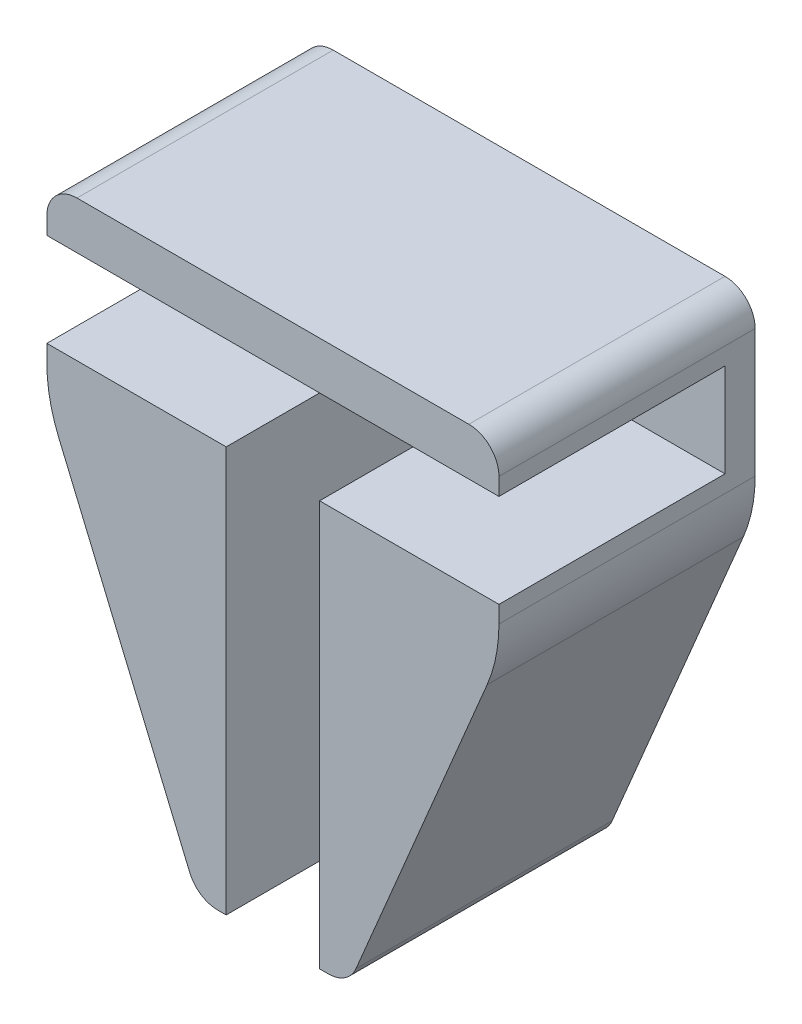
ISO-10303-21;
HEADER;
FILE_DESCRIPTION(('STEP AP214'),'2;1');
FILE_NAME('part.step','',(''),(''),'','','');
FILE_SCHEMA(('AUTOMOTIVE_DESIGN { 1 0 10303 214 1 1 1 1 }'));
ENDSEC;
DATA;
#1=APPLICATION_CONTEXT('core data for automotive mechanical design processes');
#2=APPLICATION_PROTOCOL_DEFINITION('international standard','automotive_design',2000,#1);
#3=PRODUCT_CONTEXT('',#1,'mechanical');
#4=PRODUCT('Part','Part','',(#3));
#5=PRODUCT_RELATED_PRODUCT_CATEGORY('part','',(#4));
#6=PRODUCT_DEFINITION_FORMATION('','',#4);
#7=PRODUCT_DEFINITION_CONTEXT('part definition',#1,'design');
#8=PRODUCT_DEFINITION('design','',#6,#7);
#9=PRODUCT_DEFINITION_SHAPE('','',#8);
#10=(LENGTH_UNIT() NAMED_UNIT(*) SI_UNIT(.MILLI.,.METRE.));
#11=(NAMED_UNIT(*) PLANE_ANGLE_UNIT() SI_UNIT($,.RADIAN.));
#12=(NAMED_UNIT(*) SI_UNIT($,.STERADIAN.) SOLID_ANGLE_UNIT());
#13=UNCERTAINTY_MEASURE_WITH_UNIT(LENGTH_MEASURE(1.E-05),#10,'distance_accuracy_value','');
#14=(GEOMETRIC_REPRESENTATION_CONTEXT(3) GLOBAL_UNCERTAINTY_ASSIGNED_CONTEXT((#13)) GLOBAL_UNIT_ASSIGNED_CONTEXT((#10,
#11,#12)) REPRESENTATION_CONTEXT('',''));
#15=CARTESIAN_POINT('',(0.,0.,0.));
#16=DIRECTION('',(0.,0.,1.));
#17=DIRECTION('',(1.,0.,0.));
#18=AXIS2_PLACEMENT_3D('',#15,#16,#17);
#19=CARTESIAN_POINT('',(-15.,0.,15.));
#20=DIRECTION('',(1.,0.,0.));
#21=DIRECTION('',(0.,0.,-1.));
#22=AXIS2_PLACEMENT_3D('',#19,#20,#21);
#23=PLANE('',#22);
#24=DIRECTION('',(0.,-1.,0.));
#25=VECTOR('',#24,1.);
#26=CARTESIAN_POINT('',(-15.,0.,15.));
#27=LINE('',#26,#25);
#28=CARTESIAN_POINT('',(-15.,4.25,15.));
#29=VERTEX_POINT('',#28);
#30=CARTESIAN_POINT('',(-15.,3.1,15.));
#31=VERTEX_POINT('',#30);
#32=EDGE_CURVE('E256',#29,#31,#27,.T.);
#33=ORIENTED_EDGE('',*,*,#32,.F.);
#34=DIRECTION('',(0.,0.,-1.));
#35=VECTOR('',#34,1.);
#36=CARTESIAN_POINT('',(-15.,4.25,15.));
#37=LINE('',#36,#35);
#38=CARTESIAN_POINT('',(-15.,4.25,-2.));
#39=VERTEX_POINT('',#38);
#40=EDGE_CURVE('E295',#29,#39,#37,.T.);
#41=ORIENTED_EDGE('',*,*,#40,.T.);
#42=DIRECTION('',(0.,-1.,0.));
#43=VECTOR('',#42,1.);
#44=CARTESIAN_POINT('',(-15.,6.25,-2.));
#45=LINE('',#44,#43);
#46=CARTESIAN_POINT('',(-15.,-4.23058983988962,-2.));
#47=VERTEX_POINT('',#46);
#48=EDGE_CURVE('E245',#39,#47,#45,.T.);
#49=ORIENTED_EDGE('',*,*,#48,.T.);
#50=DIRECTION('',(0.,0.,1.));
#51=VECTOR('',#50,1.);
#52=CARTESIAN_POINT('',(-15.,-4.23058983988962,15.));
#53=LINE('',#52,#51);
#54=CARTESIAN_POINT('',(-15.,-4.23058983988962,15.));
#55=VERTEX_POINT('',#54);
#56=EDGE_CURVE('E274',#47,#55,#53,.T.);
#57=ORIENTED_EDGE('',*,*,#56,.T.);
#58=DIRECTION('',(0.,-1.,0.));
#59=VECTOR('',#58,1.);
#60=CARTESIAN_POINT('',(-15.,0.,15.));
#61=LINE('',#60,#59);
#62=CARTESIAN_POINT('',(-15.,-3.1,15.));
#63=VERTEX_POINT('',#62);
#64=EDGE_CURVE('E214',#63,#55,#61,.T.);
#65=ORIENTED_EDGE('',*,*,#64,.F.);
#66=DIRECTION('',(0.,0.,-1.));
#67=VECTOR('',#66,1.);
#68=CARTESIAN_POINT('',(-15.,-3.1,15.));
#69=LINE('',#68,#67);
#70=CARTESIAN_POINT('',(-15.,-3.1,0.));
#71=VERTEX_POINT('',#70);
#72=EDGE_CURVE('E227',#63,#71,#69,.T.);
#73=ORIENTED_EDGE('',*,*,#72,.T.);
#74=DIRECTION('',(0.,-1.,0.));
#75=VECTOR('',#74,1.);
#76=CARTESIAN_POINT('',(-15.,6.25,0.));
#77=LINE('',#76,#75);
#78=CARTESIAN_POINT('',(-15.,3.1,0.));
#79=VERTEX_POINT('',#78);
#80=EDGE_CURVE('E237',#79,#71,#77,.T.);
#81=ORIENTED_EDGE('',*,*,#80,.F.);
#82=DIRECTION('',(0.,0.,-1.));
#83=VECTOR('',#82,1.);
#84=CARTESIAN_POINT('',(-15.,3.1,15.));
#85=LINE('',#84,#83);
#86=EDGE_CURVE('E271',#31,#79,#85,.T.);
#87=ORIENTED_EDGE('',*,*,#86,.F.);
#88=EDGE_LOOP('',(#33,#41,#49,#57,#65,#73,#81,#87));
#89=FACE_BOUND('',#88,.T.);
#90=ADVANCED_FACE('F36',(#89),#23,.F.);
#91=CARTESIAN_POINT('',(0.,3.1,15.));
#92=DIRECTION('',(0.,1.,0.));
#93=DIRECTION('',(0.,0.,1.));
#94=AXIS2_PLACEMENT_3D('',#91,#92,#93);
#95=PLANE('',#94);
#96=DIRECTION('',(1.,0.,0.));
#97=VECTOR('',#96,1.);
#98=CARTESIAN_POINT('',(0.,3.1,0.));
#99=LINE('',#98,#97);
#100=CARTESIAN_POINT('',(15.,3.1,0.));
#101=VERTEX_POINT('',#100);
#102=EDGE_CURVE('E250',#79,#101,#99,.T.);
#103=ORIENTED_EDGE('',*,*,#102,.T.);
#104=DIRECTION('',(0.,0.,-1.));
#105=VECTOR('',#104,1.);
#106=CARTESIAN_POINT('',(15.,3.1,15.));
#107=LINE('',#106,#105);
#108=CARTESIAN_POINT('',(15.,3.1,15.));
#109=VERTEX_POINT('',#108);
#110=EDGE_CURVE('E266',#109,#101,#107,.T.);
#111=ORIENTED_EDGE('',*,*,#110,.F.);
#112=DIRECTION('',(1.,0.,0.));
#113=VECTOR('',#112,1.);
#114=CARTESIAN_POINT('',(0.,3.1,15.));
#115=LINE('',#114,#113);
#116=EDGE_CURVE('E258',#31,#109,#115,.T.);
#117=ORIENTED_EDGE('',*,*,#116,.F.);
#118=ORIENTED_EDGE('',*,*,#86,.T.);
#119=EDGE_LOOP('',(#103,#111,#117,#118));
#120=FACE_BOUND('',#119,.T.);
#121=ADVANCED_FACE('F371',(#120),#95,.F.);
#122=CARTESIAN_POINT('',(15.,0.,15.));
#123=DIRECTION('',(1.,0.,0.));
#124=DIRECTION('',(0.,0.,-1.));
#125=AXIS2_PLACEMENT_3D('',#122,#123,#124);
#126=PLANE('',#125);
#127=DIRECTION('',(0.,-1.,0.));
#128=VECTOR('',#127,1.);
#129=CARTESIAN_POINT('',(15.,6.25,-2.));
#130=LINE('',#129,#128);
#131=CARTESIAN_POINT('',(15.,4.25,-2.));
#132=VERTEX_POINT('',#131);
#133=CARTESIAN_POINT('',(15.,-4.23058983988962,-2.));
#134=VERTEX_POINT('',#133);
#135=EDGE_CURVE('E234',#132,#134,#130,.T.);
#136=ORIENTED_EDGE('',*,*,#135,.F.);
#137=DIRECTION('',(0.,0.,-1.));
#138=VECTOR('',#137,1.);
#139=CARTESIAN_POINT('',(15.,4.25,15.));
#140=LINE('',#139,#138);
#141=CARTESIAN_POINT('',(15.,4.25,15.));
#142=VERTEX_POINT('',#141);
#143=EDGE_CURVE('E315',#132,#142,#140,.F.);
#144=ORIENTED_EDGE('',*,*,#143,.T.);
#145=DIRECTION('',(0.,-1.,0.));
#146=VECTOR('',#145,1.);
#147=CARTESIAN_POINT('',(15.,0.,15.));
#148=LINE('',#147,#146);
#149=EDGE_CURVE('E261',#142,#109,#148,.T.);
#150=ORIENTED_EDGE('',*,*,#149,.T.);
#151=ORIENTED_EDGE('',*,*,#110,.T.);
#152=DIRECTION('',(0.,-1.,0.));
#153=VECTOR('',#152,1.);
#154=CARTESIAN_POINT('',(15.,6.25,0.));
#155=LINE('',#154,#153);
#156=CARTESIAN_POINT('',(15.,-3.1,0.));
#157=VERTEX_POINT('',#156);
#158=EDGE_CURVE('E233',#101,#157,#155,.T.);
#159=ORIENTED_EDGE('',*,*,#158,.T.);
#160=DIRECTION('',(0.,0.,-1.));
#161=VECTOR('',#160,1.);
#162=CARTESIAN_POINT('',(15.,-3.1,15.));
#163=LINE('',#162,#161);
#164=CARTESIAN_POINT('',(15.,-3.1,15.));
#165=VERTEX_POINT('',#164);
#166=EDGE_CURVE('E203',#165,#157,#163,.T.);
#167=ORIENTED_EDGE('',*,*,#166,.F.);
#168=DIRECTION('',(0.,-1.,0.));
#169=VECTOR('',#168,1.);
#170=CARTESIAN_POINT('',(15.,0.,15.));
#171=LINE('',#170,#169);
#172=CARTESIAN_POINT('',(15.,-4.23058983988962,15.));
#173=VERTEX_POINT('',#172);
#174=EDGE_CURVE('E194',#165,#173,#171,.T.);
#175=ORIENTED_EDGE('',*,*,#174,.T.);
#176=DIRECTION('',(0.,0.,1.));
#177=VECTOR('',#176,1.);
#178=CARTESIAN_POINT('',(15.,-4.23058983988962,15.));
#179=LINE('',#178,#177);
#180=EDGE_CURVE('E292',#173,#134,#179,.F.);
#181=ORIENTED_EDGE('',*,*,#180,.T.);
#182=EDGE_LOOP('',(#136,#144,#150,#151,#159,#167,#175,#181));
#183=FACE_BOUND('',#182,.T.);
#184=ADVANCED_FACE('F380',(#183),#126,.T.);
#185=CARTESIAN_POINT('',(0.,6.25,15.));
#186=DIRECTION('',(0.,-1.,0.));
#187=DIRECTION('',(1.,0.,0.));
#188=AXIS2_PLACEMENT_3D('',#185,#186,#187);
#189=PLANE('',#188);
#190=DIRECTION('',(-1.,0.,0.));
#191=VECTOR('',#190,1.);
#192=CARTESIAN_POINT('',(15.,6.25,-2.));
#193=LINE('',#192,#191);
#194=CARTESIAN_POINT('',(13.,6.25,-2.));
#195=VERTEX_POINT('',#194);
#196=CARTESIAN_POINT('',(-13.,6.25,-2.));
#197=VERTEX_POINT('',#196);
#198=EDGE_CURVE('E247',#195,#197,#193,.T.);
#199=ORIENTED_EDGE('',*,*,#198,.T.);
#200=DIRECTION('',(0.,0.,-1.));
#201=VECTOR('',#200,1.);
#202=CARTESIAN_POINT('',(-13.,6.25,15.));
#203=LINE('',#202,#201);
#204=CARTESIAN_POINT('',(-13.,6.25,15.));
#205=VERTEX_POINT('',#204);
#206=EDGE_CURVE('E309',#197,#205,#203,.F.);
#207=ORIENTED_EDGE('',*,*,#206,.T.);
#208=DIRECTION('',(-1.,0.,0.));
#209=VECTOR('',#208,1.);
#210=CARTESIAN_POINT('',(0.,6.25,15.));
#211=LINE('',#210,#209);
#212=CARTESIAN_POINT('',(13.,6.25,15.));
#213=VERTEX_POINT('',#212);
#214=EDGE_CURVE('E263',#213,#205,#211,.T.);
#215=ORIENTED_EDGE('',*,*,#214,.F.);
#216=DIRECTION('',(0.,0.,-1.));
#217=VECTOR('',#216,1.);
#218=CARTESIAN_POINT('',(13.,6.25,-2.));
#219=LINE('',#218,#217);
#220=EDGE_CURVE('E306',#213,#195,#219,.T.);
#221=ORIENTED_EDGE('',*,*,#220,.T.);
#222=EDGE_LOOP('',(#199,#207,#215,#221));
#223=FACE_BOUND('',#222,.T.);
#224=ADVANCED_FACE('F360',(#223),#189,.F.);
#225=CARTESIAN_POINT('',(0.,0.,15.));
#226=DIRECTION('',(0.,0.,1.));
#227=DIRECTION('',(1.,0.,0.));
#228=AXIS2_PLACEMENT_3D('',#225,#226,#227);
#229=PLANE('',#228);
#230=ORIENTED_EDGE('',*,*,#214,.T.);
#231=CARTESIAN_POINT('',(-13.,4.25,15.));
#232=DIRECTION('',(0.,0.,1.));
#233=DIRECTION('',(1.,0.,0.));
#234=AXIS2_PLACEMENT_3D('',#231,#232,#233);
#235=CIRCLE('',#234,2.);
#236=EDGE_CURVE('E313',#205,#29,#235,.T.);
#237=ORIENTED_EDGE('',*,*,#236,.T.);
#238=ORIENTED_EDGE('',*,*,#32,.T.);
#239=ORIENTED_EDGE('',*,*,#116,.T.);
#240=ORIENTED_EDGE('',*,*,#149,.F.);
#241=CARTESIAN_POINT('',(13.,4.25,15.));
#242=DIRECTION('',(0.,0.,1.));
#243=DIRECTION('',(1.,0.,0.));
#244=AXIS2_PLACEMENT_3D('',#241,#242,#243);
#245=CIRCLE('',#244,2.);
#246=EDGE_CURVE('E311',#142,#213,#245,.T.);
#247=ORIENTED_EDGE('',*,*,#246,.T.);
#248=EDGE_LOOP('',(#230,#237,#238,#239,#240,#247));
#249=FACE_BOUND('',#248,.T.);
#250=ADVANCED_FACE('F366',(#249),#229,.T.);
#251=CARTESIAN_POINT('',(0.,0.,0.));
#252=DIRECTION('',(0.,0.,1.));
#253=DIRECTION('',(1.,0.,0.));
#254=AXIS2_PLACEMENT_3D('',#251,#252,#253);
#255=PLANE('',#254);
#256=DIRECTION('',(1.,0.,0.));
#257=VECTOR('',#256,1.);
#258=CARTESIAN_POINT('',(0.,-3.1,0.));
#259=LINE('',#258,#257);
#260=CARTESIAN_POINT('',(3.1,-3.1,0.));
#261=VERTEX_POINT('',#260);
#262=EDGE_CURVE('E179',#261,#157,#259,.T.);
#263=ORIENTED_EDGE('',*,*,#262,.T.);
#264=ORIENTED_EDGE('',*,*,#158,.F.);
#265=ORIENTED_EDGE('',*,*,#102,.F.);
#266=ORIENTED_EDGE('',*,*,#80,.T.);
#267=DIRECTION('',(1.,0.,0.));
#268=VECTOR('',#267,1.);
#269=CARTESIAN_POINT('',(0.,-3.1,0.));
#270=LINE('',#269,#268);
#271=CARTESIAN_POINT('',(-3.1,-3.1,0.));
#272=VERTEX_POINT('',#271);
#273=EDGE_CURVE('E211',#71,#272,#270,.T.);
#274=ORIENTED_EDGE('',*,*,#273,.T.);
#275=DIRECTION('',(0.,-1.,0.));
#276=VECTOR('',#275,1.);
#277=CARTESIAN_POINT('',(-3.1,0.,0.));
#278=LINE('',#277,#276);
#279=CARTESIAN_POINT('',(-3.1,-30.,0.));
#280=VERTEX_POINT('',#279);
#281=EDGE_CURVE('E182',#272,#280,#278,.T.);
#282=ORIENTED_EDGE('',*,*,#281,.T.);
#283=DIRECTION('',(1.,0.,0.));
#284=VECTOR('',#283,1.);
#285=CARTESIAN_POINT('',(-5.,-30.,0.));
#286=LINE('',#285,#284);
#287=CARTESIAN_POINT('',(3.1,-30.,0.));
#288=VERTEX_POINT('',#287);
#289=EDGE_CURVE('E253',#280,#288,#286,.T.);
#290=ORIENTED_EDGE('',*,*,#289,.T.);
#291=DIRECTION('',(0.,-1.,0.));
#292=VECTOR('',#291,1.);
#293=CARTESIAN_POINT('',(3.1,0.,0.));
#294=LINE('',#293,#292);
#295=EDGE_CURVE('E195',#261,#288,#294,.T.);
#296=ORIENTED_EDGE('',*,*,#295,.F.);
#297=EDGE_LOOP('',(#263,#264,#265,#266,#274,#282,#290,#296));
#298=FACE_BOUND('',#297,.T.);
#299=ADVANCED_FACE('F397',(#298),#255,.T.);
#300=CARTESIAN_POINT('',(5.,-30.,-2.));
#301=DIRECTION('',(0.921635375138065,-0.388057000058133,0.));
#302=DIRECTION('',(0.388057000058133,0.921635375138065,0.));
#303=AXIS2_PLACEMENT_3D('',#300,#301,#302);
#304=PLANE('',#303);
#305=DIRECTION('',(0.388057000058133,0.921635375138065,0.));
#306=VECTOR('',#305,1.);
#307=CARTESIAN_POINT('',(14.9764705882353,-6.30588235294117,15.));
#308=LINE('',#307,#306);
#309=CARTESIAN_POINT('',(5.51532042100368,-28.7761140001163,15.));
#310=VERTEX_POINT('',#309);
#311=CARTESIAN_POINT('',(14.2163537513807,-8.11115984047095,15.));
#312=VERTEX_POINT('',#311);
#313=EDGE_CURVE('E200',#310,#312,#308,.T.);
#314=ORIENTED_EDGE('',*,*,#313,.F.);
#315=DIRECTION('',(0.,0.,1.));
#316=VECTOR('',#315,1.);
#317=CARTESIAN_POINT('',(5.51532042100368,-28.7761140001163,-2.));
#318=LINE('',#317,#316);
#319=CARTESIAN_POINT('',(5.51532042100368,-28.7761140001163,-2.));
#320=VERTEX_POINT('',#319);
#321=EDGE_CURVE('E11',#310,#320,#318,.F.);
#322=ORIENTED_EDGE('',*,*,#321,.T.);
#323=DIRECTION('',(0.388057000058133,0.921635375138065,0.));
#324=VECTOR('',#323,1.);
#325=CARTESIAN_POINT('',(5.,-30.,-2.));
#326=LINE('',#325,#324);
#327=CARTESIAN_POINT('',(14.2163537513807,-8.11115984047095,-2.));
#328=VERTEX_POINT('',#327);
#329=EDGE_CURVE('E236',#320,#328,#326,.T.);
#330=ORIENTED_EDGE('',*,*,#329,.T.);
#331=DIRECTION('',(0.,0.,1.));
#332=VECTOR('',#331,1.);
#333=CARTESIAN_POINT('',(14.2163537513807,-8.11115984047095,-2.));
#334=LINE('',#333,#332);
#335=EDGE_CURVE('E287',#328,#312,#334,.T.);
#336=ORIENTED_EDGE('',*,*,#335,.T.);
#337=EDGE_LOOP('',(#314,#322,#330,#336));
#338=FACE_BOUND('',#337,.T.);
#339=ADVANCED_FACE('F399',(#338),#304,.T.);
#340=CARTESIAN_POINT('',(-5.,-30.,-2.));
#341=DIRECTION('',(0.,-1.,0.));
#342=DIRECTION('',(1.,0.,0.));
#343=AXIS2_PLACEMENT_3D('',#340,#341,#342);
#344=PLANE('',#343);
#345=DIRECTION('',(1.,0.,0.));
#346=VECTOR('',#345,1.);
#347=CARTESIAN_POINT('',(0.,-30.,15.));
#348=LINE('',#347,#346);
#349=CARTESIAN_POINT('',(-3.67204967072755,-30.,15.));
#350=VERTEX_POINT('',#349);
#351=CARTESIAN_POINT('',(-3.1,-30.,15.));
#352=VERTEX_POINT('',#351);
#353=EDGE_CURVE('E220',#350,#352,#348,.T.);
#354=ORIENTED_EDGE('',*,*,#353,.F.);
#355=DIRECTION('',(0.,0.,1.));
#356=VECTOR('',#355,1.);
#357=CARTESIAN_POINT('',(-3.67204967072755,-30.,-2.));
#358=LINE('',#357,#356);
#359=CARTESIAN_POINT('',(-3.67204967072755,-30.,-2.));
#360=VERTEX_POINT('',#359);
#361=EDGE_CURVE('E324',#350,#360,#358,.F.);
#362=ORIENTED_EDGE('',*,*,#361,.T.);
#363=DIRECTION('',(1.,0.,0.));
#364=VECTOR('',#363,1.);
#365=CARTESIAN_POINT('',(-5.,-30.,-2.));
#366=LINE('',#365,#364);
#367=CARTESIAN_POINT('',(3.67204967072755,-30.,-2.));
#368=VERTEX_POINT('',#367);
#369=EDGE_CURVE('E239',#360,#368,#366,.T.);
#370=ORIENTED_EDGE('',*,*,#369,.T.);
#371=DIRECTION('',(0.,0.,1.));
#372=VECTOR('',#371,1.);
#373=CARTESIAN_POINT('',(3.67204967072755,-30.,-2.));
#374=LINE('',#373,#372);
#375=CARTESIAN_POINT('',(3.67204967072755,-30.,15.));
#376=VERTEX_POINT('',#375);
#377=EDGE_CURVE('E322',#368,#376,#374,.T.);
#378=ORIENTED_EDGE('',*,*,#377,.T.);
#379=DIRECTION('',(1.,0.,0.));
#380=VECTOR('',#379,1.);
#381=CARTESIAN_POINT('',(0.,-30.,15.));
#382=LINE('',#381,#380);
#383=CARTESIAN_POINT('',(3.1,-30.,15.));
#384=VERTEX_POINT('',#383);
#385=EDGE_CURVE('E190',#384,#376,#382,.T.);
#386=ORIENTED_EDGE('',*,*,#385,.F.);
#387=DIRECTION('',(0.,0.,-1.));
#388=VECTOR('',#387,1.);
#389=CARTESIAN_POINT('',(3.1,-30.,15.));
#390=LINE('',#389,#388);
#391=EDGE_CURVE('E183',#384,#288,#390,.T.);
#392=ORIENTED_EDGE('',*,*,#391,.T.);
#393=ORIENTED_EDGE('',*,*,#289,.F.);
#394=DIRECTION('',(0.,0.,-1.));
#395=VECTOR('',#394,1.);
#396=CARTESIAN_POINT('',(-3.1,-30.,15.));
#397=LINE('',#396,#395);
#398=EDGE_CURVE('E222',#352,#280,#397,.T.);
#399=ORIENTED_EDGE('',*,*,#398,.F.);
#400=EDGE_LOOP('',(#354,#362,#370,#378,#386,#392,#393,#399));
#401=FACE_BOUND('',#400,.T.);
#402=ADVANCED_FACE('F329',(#401),#344,.T.);
#403=CARTESIAN_POINT('',(-15.,-6.25,-2.));
#404=DIRECTION('',(-0.921635375138065,-0.388057000058133,0.));
#405=DIRECTION('',(0.388057000058133,-0.921635375138065,0.));
#406=AXIS2_PLACEMENT_3D('',#403,#404,#405);
#407=PLANE('',#406);
#408=DIRECTION('',(0.388057000058133,-0.921635375138065,0.));
#409=VECTOR('',#408,1.);
#410=CARTESIAN_POINT('',(-15.,-6.25,-2.));
#411=LINE('',#410,#409);
#412=CARTESIAN_POINT('',(-14.2163537513807,-8.11115984047095,-2.));
#413=VERTEX_POINT('',#412);
#414=CARTESIAN_POINT('',(-5.51532042100368,-28.7761140001163,-2.));
#415=VERTEX_POINT('',#414);
#416=EDGE_CURVE('E242',#413,#415,#411,.T.);
#417=ORIENTED_EDGE('',*,*,#416,.T.);
#418=DIRECTION('',(0.,0.,1.));
#419=VECTOR('',#418,1.);
#420=CARTESIAN_POINT('',(-5.51532042100368,-28.7761140001163,-2.));
#421=LINE('',#420,#419);
#422=CARTESIAN_POINT('',(-5.51532042100368,-28.7761140001163,15.));
#423=VERTEX_POINT('',#422);
#424=EDGE_CURVE('E317',#415,#423,#421,.T.);
#425=ORIENTED_EDGE('',*,*,#424,.T.);
#426=DIRECTION('',(0.388057000058133,-0.921635375138065,0.));
#427=VECTOR('',#426,1.);
#428=CARTESIAN_POINT('',(-14.9764705882353,-6.30588235294118,15.));
#429=LINE('',#428,#427);
#430=CARTESIAN_POINT('',(-14.2163537513807,-8.11115984047095,15.));
#431=VERTEX_POINT('',#430);
#432=EDGE_CURVE('E217',#431,#423,#429,.T.);
#433=ORIENTED_EDGE('',*,*,#432,.F.);
#434=DIRECTION('',(0.,0.,1.));
#435=VECTOR('',#434,1.);
#436=CARTESIAN_POINT('',(-14.2163537513807,-8.11115984047095,-2.));
#437=LINE('',#436,#435);
#438=EDGE_CURVE('E279',#431,#413,#437,.F.);
#439=ORIENTED_EDGE('',*,*,#438,.T.);
#440=EDGE_LOOP('',(#417,#425,#433,#439));
#441=FACE_BOUND('',#440,.T.);
#442=ADVANCED_FACE('F343',(#441),#407,.T.);
#443=CARTESIAN_POINT('',(0.,0.,-2.));
#444=DIRECTION('',(0.,0.,1.));
#445=DIRECTION('',(1.,0.,0.));
#446=AXIS2_PLACEMENT_3D('',#443,#444,#445);
#447=PLANE('',#446);
#448=ORIENTED_EDGE('',*,*,#48,.F.);
#449=CARTESIAN_POINT('',(-13.,4.25,-2.));
#450=DIRECTION('',(0.,0.,1.));
#451=DIRECTION('',(1.,0.,0.));
#452=AXIS2_PLACEMENT_3D('',#449,#450,#451);
#453=CIRCLE('',#452,2.);
#454=EDGE_CURVE('E304',#39,#197,#453,.F.);
#455=ORIENTED_EDGE('',*,*,#454,.T.);
#456=ORIENTED_EDGE('',*,*,#198,.F.);
#457=CARTESIAN_POINT('',(13.,4.25,-2.));
#458=DIRECTION('',(0.,0.,1.));
#459=DIRECTION('',(1.,0.,0.));
#460=AXIS2_PLACEMENT_3D('',#457,#458,#459);
#461=CIRCLE('',#460,2.);
#462=EDGE_CURVE('E302',#195,#132,#461,.F.);
#463=ORIENTED_EDGE('',*,*,#462,.T.);
#464=ORIENTED_EDGE('',*,*,#135,.T.);
#465=CARTESIAN_POINT('',(5.,-4.23058983988962,-2.));
#466=DIRECTION('',(0.,0.,1.));
#467=DIRECTION('',(1.,0.,0.));
#468=AXIS2_PLACEMENT_3D('',#465,#466,#467);
#469=CIRCLE('',#468,10.);
#470=EDGE_CURVE('E281',#134,#328,#469,.F.);
#471=ORIENTED_EDGE('',*,*,#470,.T.);
#472=ORIENTED_EDGE('',*,*,#329,.F.);
#473=CARTESIAN_POINT('',(3.67204967072755,-28.,-2.));
#474=DIRECTION('',(0.,0.,1.));
#475=DIRECTION('',(1.,0.,0.));
#476=AXIS2_PLACEMENT_3D('',#473,#474,#475);
#477=CIRCLE('',#476,2.);
#478=EDGE_CURVE('E298',#320,#368,#477,.F.);
#479=ORIENTED_EDGE('',*,*,#478,.T.);
#480=ORIENTED_EDGE('',*,*,#369,.F.);
#481=CARTESIAN_POINT('',(-3.67204967072755,-28.,-2.));
#482=DIRECTION('',(0.,0.,1.));
#483=DIRECTION('',(1.,0.,0.));
#484=AXIS2_PLACEMENT_3D('',#481,#482,#483);
#485=CIRCLE('',#484,2.);
#486=EDGE_CURVE('E300',#360,#415,#485,.F.);
#487=ORIENTED_EDGE('',*,*,#486,.T.);
#488=ORIENTED_EDGE('',*,*,#416,.F.);
#489=CARTESIAN_POINT('',(-5.,-4.23058983988962,-2.));
#490=DIRECTION('',(0.,0.,1.));
#491=DIRECTION('',(1.,0.,0.));
#492=AXIS2_PLACEMENT_3D('',#489,#490,#491);
#493=CIRCLE('',#492,10.);
#494=EDGE_CURVE('E284',#413,#47,#493,.F.);
#495=ORIENTED_EDGE('',*,*,#494,.T.);
#496=EDGE_LOOP('',(#448,#455,#456,#463,#464,#471,#472,#479,#480,#487,#488,#495));
#497=FACE_BOUND('',#496,.T.);
#498=ADVANCED_FACE('F335',(#497),#447,.F.);
#499=CARTESIAN_POINT('',(-3.1,0.,15.));
#500=DIRECTION('',(1.,0.,0.));
#501=DIRECTION('',(0.,1.,0.));
#502=AXIS2_PLACEMENT_3D('',#499,#500,#501);
#503=PLANE('',#502);
#504=ORIENTED_EDGE('',*,*,#281,.F.);
#505=DIRECTION('',(0.,0.,-1.));
#506=VECTOR('',#505,1.);
#507=CARTESIAN_POINT('',(-3.1,-3.1,15.));
#508=LINE('',#507,#506);
#509=CARTESIAN_POINT('',(-3.1,-3.1,15.));
#510=VERTEX_POINT('',#509);
#511=EDGE_CURVE('E230',#510,#272,#508,.T.);
#512=ORIENTED_EDGE('',*,*,#511,.F.);
#513=DIRECTION('',(0.,-1.,0.));
#514=VECTOR('',#513,1.);
#515=CARTESIAN_POINT('',(-3.1,0.,15.));
#516=LINE('',#515,#514);
#517=EDGE_CURVE('E207',#510,#352,#516,.T.);
#518=ORIENTED_EDGE('',*,*,#517,.T.);
#519=ORIENTED_EDGE('',*,*,#398,.T.);
#520=EDGE_LOOP('',(#504,#512,#518,#519));
#521=FACE_BOUND('',#520,.T.);
#522=ADVANCED_FACE('F392',(#521),#503,.T.);
#523=CARTESIAN_POINT('',(0.,-3.1,15.));
#524=DIRECTION('',(0.,1.,0.));
#525=DIRECTION('',(0.,0.,1.));
#526=AXIS2_PLACEMENT_3D('',#523,#524,#525);
#527=PLANE('',#526);
#528=ORIENTED_EDGE('',*,*,#273,.F.);
#529=ORIENTED_EDGE('',*,*,#72,.F.);
#530=DIRECTION('',(1.,0.,0.));
#531=VECTOR('',#530,1.);
#532=CARTESIAN_POINT('',(0.,-3.1,15.));
#533=LINE('',#532,#531);
#534=EDGE_CURVE('E210',#63,#510,#533,.T.);
#535=ORIENTED_EDGE('',*,*,#534,.T.);
#536=ORIENTED_EDGE('',*,*,#511,.T.);
#537=EDGE_LOOP('',(#528,#529,#535,#536));
#538=FACE_BOUND('',#537,.T.);
#539=ADVANCED_FACE('F396',(#538),#527,.T.);
#540=CARTESIAN_POINT('',(0.,0.,15.));
#541=DIRECTION('',(0.,0.,1.));
#542=DIRECTION('',(1.,0.,0.));
#543=AXIS2_PLACEMENT_3D('',#540,#541,#542);
#544=PLANE('',#543);
#545=ORIENTED_EDGE('',*,*,#432,.T.);
#546=CARTESIAN_POINT('',(-3.67204967072755,-28.,15.));
#547=DIRECTION('',(0.,0.,1.));
#548=DIRECTION('',(1.,0.,0.));
#549=AXIS2_PLACEMENT_3D('',#546,#547,#548);
#550=CIRCLE('',#549,2.);
#551=EDGE_CURVE('E320',#423,#350,#550,.T.);
#552=ORIENTED_EDGE('',*,*,#551,.T.);
#553=ORIENTED_EDGE('',*,*,#353,.T.);
#554=ORIENTED_EDGE('',*,*,#517,.F.);
#555=ORIENTED_EDGE('',*,*,#534,.F.);
#556=ORIENTED_EDGE('',*,*,#64,.T.);
#557=CARTESIAN_POINT('',(-5.,-4.23058983988962,15.));
#558=DIRECTION('',(0.,0.,1.));
#559=DIRECTION('',(1.,0.,0.));
#560=AXIS2_PLACEMENT_3D('',#557,#558,#559);
#561=CIRCLE('',#560,10.);
#562=EDGE_CURVE('E277',#55,#431,#561,.T.);
#563=ORIENTED_EDGE('',*,*,#562,.T.);
#564=EDGE_LOOP('',(#545,#552,#553,#554,#555,#556,#563));
#565=FACE_BOUND('',#564,.T.);
#566=ADVANCED_FACE('F346',(#565),#544,.T.);
#567=CARTESIAN_POINT('',(0.,-3.1,15.));
#568=DIRECTION('',(0.,1.,0.));
#569=DIRECTION('',(0.,0.,1.));
#570=AXIS2_PLACEMENT_3D('',#567,#568,#569);
#571=PLANE('',#570);
#572=ORIENTED_EDGE('',*,*,#262,.F.);
#573=DIRECTION('',(0.,0.,-1.));
#574=VECTOR('',#573,1.);
#575=CARTESIAN_POINT('',(3.1,-3.1,15.));
#576=LINE('',#575,#574);
#577=CARTESIAN_POINT('',(3.1,-3.1,15.));
#578=VERTEX_POINT('',#577);
#579=EDGE_CURVE('E172',#578,#261,#576,.T.);
#580=ORIENTED_EDGE('',*,*,#579,.F.);
#581=DIRECTION('',(1.,0.,0.));
#582=VECTOR('',#581,1.);
#583=CARTESIAN_POINT('',(0.,-3.1,15.));
#584=LINE('',#583,#582);
#585=EDGE_CURVE('E177',#578,#165,#584,.T.);
#586=ORIENTED_EDGE('',*,*,#585,.T.);
#587=ORIENTED_EDGE('',*,*,#166,.T.);
#588=EDGE_LOOP('',(#572,#580,#586,#587));
#589=FACE_BOUND('',#588,.T.);
#590=ADVANCED_FACE('F174',(#589),#571,.T.);
#591=CARTESIAN_POINT('',(3.1,0.,15.));
#592=DIRECTION('',(1.,0.,0.));
#593=DIRECTION('',(0.,1.,0.));
#594=AXIS2_PLACEMENT_3D('',#591,#592,#593);
#595=PLANE('',#594);
#596=ORIENTED_EDGE('',*,*,#295,.T.);
#597=ORIENTED_EDGE('',*,*,#391,.F.);
#598=DIRECTION('',(0.,-1.,0.));
#599=VECTOR('',#598,1.);
#600=CARTESIAN_POINT('',(3.1,0.,15.));
#601=LINE('',#600,#599);
#602=EDGE_CURVE('E186',#578,#384,#601,.T.);
#603=ORIENTED_EDGE('',*,*,#602,.F.);
#604=ORIENTED_EDGE('',*,*,#579,.T.);
#605=EDGE_LOOP('',(#596,#597,#603,#604));
#606=FACE_BOUND('',#605,.T.);
#607=ADVANCED_FACE('F187',(#606),#595,.F.);
#608=CARTESIAN_POINT('',(0.,0.,15.));
#609=DIRECTION('',(0.,0.,1.));
#610=DIRECTION('',(1.,0.,0.));
#611=AXIS2_PLACEMENT_3D('',#608,#609,#610);
#612=PLANE('',#611);
#613=ORIENTED_EDGE('',*,*,#385,.T.);
#614=CARTESIAN_POINT('',(3.67204967072755,-28.,15.));
#615=DIRECTION('',(0.,0.,1.));
#616=DIRECTION('',(1.,0.,0.));
#617=AXIS2_PLACEMENT_3D('',#614,#615,#616);
#618=CIRCLE('',#617,2.);
#619=EDGE_CURVE('E44',#376,#310,#618,.T.);
#620=ORIENTED_EDGE('',*,*,#619,.T.);
#621=ORIENTED_EDGE('',*,*,#313,.T.);
#622=CARTESIAN_POINT('',(5.,-4.23058983988962,15.));
#623=DIRECTION('',(0.,0.,1.));
#624=DIRECTION('',(1.,0.,0.));
#625=AXIS2_PLACEMENT_3D('',#622,#623,#624);
#626=CIRCLE('',#625,10.);
#627=EDGE_CURVE('E290',#312,#173,#626,.T.);
#628=ORIENTED_EDGE('',*,*,#627,.T.);
#629=ORIENTED_EDGE('',*,*,#174,.F.);
#630=ORIENTED_EDGE('',*,*,#585,.F.);
#631=ORIENTED_EDGE('',*,*,#602,.T.);
#632=EDGE_LOOP('',(#613,#620,#621,#628,#629,#630,#631));
#633=FACE_BOUND('',#632,.T.);
#634=ADVANCED_FACE('F192',(#633),#612,.T.);
#635=CARTESIAN_POINT('',(-5.,-4.23058983988962,15.));
#636=DIRECTION('',(0.,0.,-1.));
#637=DIRECTION('',(-1.,0.,0.));
#638=AXIS2_PLACEMENT_3D('',#635,#636,#637);
#639=CYLINDRICAL_SURFACE('',#638,10.);
#640=ORIENTED_EDGE('',*,*,#494,.F.);
#641=ORIENTED_EDGE('',*,*,#438,.F.);
#642=ORIENTED_EDGE('',*,*,#562,.F.);
#643=ORIENTED_EDGE('',*,*,#56,.F.);
#644=EDGE_LOOP('',(#640,#641,#642,#643));
#645=FACE_BOUND('',#644,.T.);
#646=ADVANCED_FACE('F352',(#645),#639,.T.);
#647=CARTESIAN_POINT('',(5.,-4.23058983988962,-2.));
#648=DIRECTION('',(0.,0.,1.));
#649=DIRECTION('',(1.,0.,0.));
#650=AXIS2_PLACEMENT_3D('',#647,#648,#649);
#651=CYLINDRICAL_SURFACE('',#650,10.);
#652=ORIENTED_EDGE('',*,*,#470,.F.);
#653=ORIENTED_EDGE('',*,*,#180,.F.);
#654=ORIENTED_EDGE('',*,*,#627,.F.);
#655=ORIENTED_EDGE('',*,*,#335,.F.);
#656=EDGE_LOOP('',(#652,#653,#654,#655));
#657=FACE_BOUND('',#656,.T.);
#658=ADVANCED_FACE('F386',(#657),#651,.T.);
#659=CARTESIAN_POINT('',(-13.,4.25,15.));
#660=DIRECTION('',(0.,0.,-1.));
#661=DIRECTION('',(-1.,0.,0.));
#662=AXIS2_PLACEMENT_3D('',#659,#660,#661);
#663=CYLINDRICAL_SURFACE('',#662,2.);
#664=ORIENTED_EDGE('',*,*,#236,.F.);
#665=ORIENTED_EDGE('',*,*,#206,.F.);
#666=ORIENTED_EDGE('',*,*,#454,.F.);
#667=ORIENTED_EDGE('',*,*,#40,.F.);
#668=EDGE_LOOP('',(#664,#665,#666,#667));
#669=FACE_BOUND('',#668,.T.);
#670=ADVANCED_FACE('F364',(#669),#663,.T.);
#671=CARTESIAN_POINT('',(13.,4.25,15.));
#672=DIRECTION('',(0.,0.,1.));
#673=DIRECTION('',(1.,0.,0.));
#674=AXIS2_PLACEMENT_3D('',#671,#672,#673);
#675=CYLINDRICAL_SURFACE('',#674,2.);
#676=ORIENTED_EDGE('',*,*,#246,.F.);
#677=ORIENTED_EDGE('',*,*,#143,.F.);
#678=ORIENTED_EDGE('',*,*,#462,.F.);
#679=ORIENTED_EDGE('',*,*,#220,.F.);
#680=EDGE_LOOP('',(#676,#677,#678,#679));
#681=FACE_BOUND('',#680,.T.);
#682=ADVANCED_FACE('F378',(#681),#675,.T.);
#683=CARTESIAN_POINT('',(-3.67204967072755,-28.,-2.));
#684=DIRECTION('',(0.,0.,1.));
#685=DIRECTION('',(1.,0.,0.));
#686=AXIS2_PLACEMENT_3D('',#683,#684,#685);
#687=CYLINDRICAL_SURFACE('',#686,2.);
#688=ORIENTED_EDGE('',*,*,#486,.F.);
#689=ORIENTED_EDGE('',*,*,#361,.F.);
#690=ORIENTED_EDGE('',*,*,#551,.F.);
#691=ORIENTED_EDGE('',*,*,#424,.F.);
#692=EDGE_LOOP('',(#688,#689,#690,#691));
#693=FACE_BOUND('',#692,.T.);
#694=ADVANCED_FACE('F340',(#693),#687,.T.);
#695=CARTESIAN_POINT('',(3.67204967072755,-28.,-2.));
#696=DIRECTION('',(0.,0.,1.));
#697=DIRECTION('',(1.,0.,0.));
#698=AXIS2_PLACEMENT_3D('',#695,#696,#697);
#699=CYLINDRICAL_SURFACE('',#698,2.);
#700=ORIENTED_EDGE('',*,*,#478,.F.);
#701=ORIENTED_EDGE('',*,*,#321,.F.);
#702=ORIENTED_EDGE('',*,*,#619,.F.);
#703=ORIENTED_EDGE('',*,*,#377,.F.);
#704=EDGE_LOOP('',(#700,#701,#702,#703));
#705=FACE_BOUND('',#704,.T.);
#706=ADVANCED_FACE('F38',(#705),#699,.T.);
#707=CLOSED_SHELL('',(#90,#121,#184,#224,#250,#299,#339,#402,#442,#498,#522,#539,#566,#590,#607,
#634,#646,#658,#670,#682,#694,#706));
#708=MANIFOLD_SOLID_BREP('B2',#707);
#709=ADVANCED_BREP_SHAPE_REPRESENTATION('',(#18,#708),#14);
#710=SHAPE_DEFINITION_REPRESENTATION(#9,#709);
ENDSEC;
END-ISO-10303-21;
